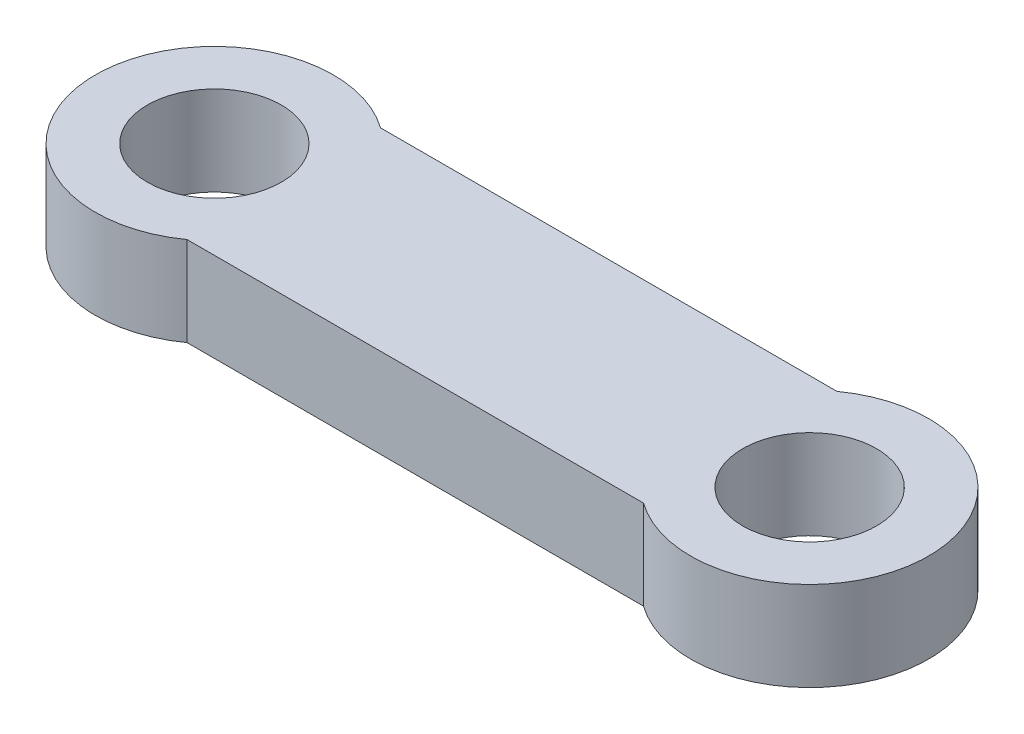
ISO-10303-21;
HEADER;
FILE_DESCRIPTION(('STEP AP214'),'2;1');
FILE_NAME('part.step','',(''),(''),'','','');
FILE_SCHEMA(('AUTOMOTIVE_DESIGN { 1 0 10303 214 1 1 1 1 }'));
ENDSEC;
DATA;
#1=APPLICATION_CONTEXT('core data for automotive mechanical design processes');
#2=APPLICATION_PROTOCOL_DEFINITION('international standard','automotive_design',2000,#1);
#3=PRODUCT_CONTEXT('',#1,'mechanical');
#4=PRODUCT('Part','Part','',(#3));
#5=PRODUCT_RELATED_PRODUCT_CATEGORY('part','',(#4));
#6=PRODUCT_DEFINITION_FORMATION('','',#4);
#7=PRODUCT_DEFINITION_CONTEXT('part definition',#1,'design');
#8=PRODUCT_DEFINITION('design','',#6,#7);
#9=PRODUCT_DEFINITION_SHAPE('','',#8);
#10=(LENGTH_UNIT() NAMED_UNIT(*) SI_UNIT(.MILLI.,.METRE.));
#11=(NAMED_UNIT(*) PLANE_ANGLE_UNIT() SI_UNIT($,.RADIAN.));
#12=(NAMED_UNIT(*) SI_UNIT($,.STERADIAN.) SOLID_ANGLE_UNIT());
#13=UNCERTAINTY_MEASURE_WITH_UNIT(LENGTH_MEASURE(1.E-05),#10,'distance_accuracy_value','');
#14=(GEOMETRIC_REPRESENTATION_CONTEXT(3) GLOBAL_UNCERTAINTY_ASSIGNED_CONTEXT((#13)) GLOBAL_UNIT_ASSIGNED_CONTEXT((#10,
#11,#12)) REPRESENTATION_CONTEXT('',''));
#15=CARTESIAN_POINT('',(0.,0.,0.));
#16=DIRECTION('',(0.,0.,1.));
#17=DIRECTION('',(1.,0.,0.));
#18=AXIS2_PLACEMENT_3D('',#15,#16,#17);
#19=CARTESIAN_POINT('',(-20.,6.,0.));
#20=DIRECTION('',(0.,-1.,0.));
#21=DIRECTION('',(0.,0.,-1.));
#22=AXIS2_PLACEMENT_3D('',#19,#20,#21);
#23=PLANE('',#22);
#24=CARTESIAN_POINT('',(-20.,6.,0.));
#25=DIRECTION('',(0.,1.,0.));
#26=DIRECTION('',(0.,0.,-1.));
#27=AXIS2_PLACEMENT_3D('',#24,#25,#26);
#28=CIRCLE('',#27,8.00000000000001);
#29=CARTESIAN_POINT('',(-15.3363104734556,6.,-6.5));
#30=VERTEX_POINT('',#29);
#31=CARTESIAN_POINT('',(-15.3363104734556,6.,6.5));
#32=VERTEX_POINT('',#31);
#33=EDGE_CURVE('E93',#30,#32,#28,.T.);
#34=ORIENTED_EDGE('',*,*,#33,.T.);
#35=DIRECTION('',(1.,0.,0.));
#36=VECTOR('',#35,1.);
#37=CARTESIAN_POINT('',(15.3363104734556,6.,6.5));
#38=LINE('',#37,#36);
#39=CARTESIAN_POINT('',(15.3363104734556,6.,6.5));
#40=VERTEX_POINT('',#39);
#41=EDGE_CURVE('E88',#32,#40,#38,.T.);
#42=ORIENTED_EDGE('',*,*,#41,.T.);
#43=CARTESIAN_POINT('',(20.,6.,0.));
#44=DIRECTION('',(0.,1.,0.));
#45=DIRECTION('',(0.,0.,1.));
#46=AXIS2_PLACEMENT_3D('',#43,#44,#45);
#47=CIRCLE('',#46,7.99999999999999);
#48=CARTESIAN_POINT('',(15.3363104734556,6.,-6.5));
#49=VERTEX_POINT('',#48);
#50=EDGE_CURVE('E91',#40,#49,#47,.T.);
#51=ORIENTED_EDGE('',*,*,#50,.T.);
#52=DIRECTION('',(-1.,0.,0.));
#53=VECTOR('',#52,1.);
#54=CARTESIAN_POINT('',(-15.3363104734556,6.,-6.5));
#55=LINE('',#54,#53);
#56=EDGE_CURVE('E58',#49,#30,#55,.T.);
#57=ORIENTED_EDGE('',*,*,#56,.T.);
#58=EDGE_LOOP('',(#34,#42,#51,#57));
#59=FACE_BOUND('',#58,.T.);
#60=CARTESIAN_POINT('',(-20.,6.,0.));
#61=DIRECTION('',(0.,1.,0.));
#62=DIRECTION('',(0.,0.,1.));
#63=AXIS2_PLACEMENT_3D('',#60,#61,#62);
#64=CIRCLE('',#63,4.5);
#65=CARTESIAN_POINT('',(-20.,6.,4.5));
#66=VERTEX_POINT('',#65);
#67=EDGE_CURVE('E108',#66,#66,#64,.T.);
#68=ORIENTED_EDGE('',*,*,#67,.F.);
#69=EDGE_LOOP('',(#68));
#70=FACE_BOUND('',#69,.T.);
#71=CARTESIAN_POINT('',(20.,6.,0.));
#72=DIRECTION('',(0.,1.,0.));
#73=DIRECTION('',(0.,0.,1.));
#74=AXIS2_PLACEMENT_3D('',#71,#72,#73);
#75=CIRCLE('',#74,4.5);
#76=CARTESIAN_POINT('',(20.,6.,4.5));
#77=VERTEX_POINT('',#76);
#78=EDGE_CURVE('E123',#77,#77,#75,.T.);
#79=ORIENTED_EDGE('',*,*,#78,.F.);
#80=EDGE_LOOP('',(#79));
#81=FACE_BOUND('',#80,.T.);
#82=ADVANCED_FACE('F41',(#59,#70,#81),#23,.F.);
#83=CARTESIAN_POINT('',(-20.,0.,0.));
#84=DIRECTION('',(0.,-1.,0.));
#85=DIRECTION('',(0.,0.,-1.));
#86=AXIS2_PLACEMENT_3D('',#83,#84,#85);
#87=PLANE('',#86);
#88=CARTESIAN_POINT('',(-20.,0.,0.));
#89=DIRECTION('',(0.,1.,0.));
#90=DIRECTION('',(0.,0.,1.));
#91=AXIS2_PLACEMENT_3D('',#88,#89,#90);
#92=CIRCLE('',#91,4.5);
#93=CARTESIAN_POINT('',(-20.,0.,4.5));
#94=VERTEX_POINT('',#93);
#95=EDGE_CURVE('E120',#94,#94,#92,.T.);
#96=ORIENTED_EDGE('',*,*,#95,.T.);
#97=EDGE_LOOP('',(#96));
#98=FACE_BOUND('',#97,.T.);
#99=CARTESIAN_POINT('',(-20.,0.,0.));
#100=DIRECTION('',(0.,1.,0.));
#101=DIRECTION('',(0.,0.,-1.));
#102=AXIS2_PLACEMENT_3D('',#99,#100,#101);
#103=CIRCLE('',#102,8.00000000000001);
#104=CARTESIAN_POINT('',(-15.3363104734556,0.,-6.5));
#105=VERTEX_POINT('',#104);
#106=CARTESIAN_POINT('',(-15.3363104734556,0.,6.5));
#107=VERTEX_POINT('',#106);
#108=EDGE_CURVE('E105',#105,#107,#103,.T.);
#109=ORIENTED_EDGE('',*,*,#108,.F.);
#110=DIRECTION('',(-1.,0.,0.));
#111=VECTOR('',#110,1.);
#112=CARTESIAN_POINT('',(-15.3363104734556,0.,-6.5));
#113=LINE('',#112,#111);
#114=CARTESIAN_POINT('',(15.3363104734556,0.,-6.5));
#115=VERTEX_POINT('',#114);
#116=EDGE_CURVE('E81',#115,#105,#113,.T.);
#117=ORIENTED_EDGE('',*,*,#116,.F.);
#118=CARTESIAN_POINT('',(20.,0.,0.));
#119=DIRECTION('',(0.,1.,0.));
#120=DIRECTION('',(0.,0.,1.));
#121=AXIS2_PLACEMENT_3D('',#118,#119,#120);
#122=CIRCLE('',#121,7.99999999999999);
#123=CARTESIAN_POINT('',(15.3363104734556,0.,6.5));
#124=VERTEX_POINT('',#123);
#125=EDGE_CURVE('E75',#124,#115,#122,.T.);
#126=ORIENTED_EDGE('',*,*,#125,.F.);
#127=DIRECTION('',(1.,0.,0.));
#128=VECTOR('',#127,1.);
#129=CARTESIAN_POINT('',(15.3363104734556,0.,6.5));
#130=LINE('',#129,#128);
#131=EDGE_CURVE('E97',#107,#124,#130,.T.);
#132=ORIENTED_EDGE('',*,*,#131,.F.);
#133=EDGE_LOOP('',(#109,#117,#126,#132));
#134=FACE_BOUND('',#133,.T.);
#135=CARTESIAN_POINT('',(20.,0.,0.));
#136=DIRECTION('',(0.,1.,0.));
#137=DIRECTION('',(0.,0.,1.));
#138=AXIS2_PLACEMENT_3D('',#135,#136,#137);
#139=CIRCLE('',#138,4.5);
#140=CARTESIAN_POINT('',(20.,0.,4.5));
#141=VERTEX_POINT('',#140);
#142=EDGE_CURVE('E126',#141,#141,#139,.T.);
#143=ORIENTED_EDGE('',*,*,#142,.T.);
#144=EDGE_LOOP('',(#143));
#145=FACE_BOUND('',#144,.T.);
#146=ADVANCED_FACE('F116',(#98,#134,#145),#87,.T.);
#147=CARTESIAN_POINT('',(-20.,6.,0.));
#148=DIRECTION('',(0.,-1.,0.));
#149=DIRECTION('',(0.,0.,-1.));
#150=AXIS2_PLACEMENT_3D('',#147,#148,#149);
#151=CYLINDRICAL_SURFACE('',#150,8.00000000000001);
#152=ORIENTED_EDGE('',*,*,#108,.T.);
#153=DIRECTION('',(0.,-1.,0.));
#154=VECTOR('',#153,1.);
#155=CARTESIAN_POINT('',(-15.3363104734556,6.,6.5));
#156=LINE('',#155,#154);
#157=EDGE_CURVE('E11',#32,#107,#156,.T.);
#158=ORIENTED_EDGE('',*,*,#157,.F.);
#159=ORIENTED_EDGE('',*,*,#33,.F.);
#160=DIRECTION('',(0.,-1.,0.));
#161=VECTOR('',#160,1.);
#162=CARTESIAN_POINT('',(-15.3363104734556,6.,-6.5));
#163=LINE('',#162,#161);
#164=EDGE_CURVE('E101',#30,#105,#163,.T.);
#165=ORIENTED_EDGE('',*,*,#164,.T.);
#166=EDGE_LOOP('',(#152,#158,#159,#165));
#167=FACE_BOUND('',#166,.T.);
#168=ADVANCED_FACE('F43',(#167),#151,.T.);
#169=CARTESIAN_POINT('',(15.3363104734556,6.,6.5));
#170=DIRECTION('',(0.,0.,-1.));
#171=DIRECTION('',(-1.,0.,0.));
#172=AXIS2_PLACEMENT_3D('',#169,#170,#171);
#173=PLANE('',#172);
#174=ORIENTED_EDGE('',*,*,#131,.T.);
#175=DIRECTION('',(0.,-1.,0.));
#176=VECTOR('',#175,1.);
#177=CARTESIAN_POINT('',(15.3363104734556,6.,6.5));
#178=LINE('',#177,#176);
#179=EDGE_CURVE('E50',#40,#124,#178,.T.);
#180=ORIENTED_EDGE('',*,*,#179,.F.);
#181=ORIENTED_EDGE('',*,*,#41,.F.);
#182=ORIENTED_EDGE('',*,*,#157,.T.);
#183=EDGE_LOOP('',(#174,#180,#181,#182));
#184=FACE_BOUND('',#183,.T.);
#185=ADVANCED_FACE('F96',(#184),#173,.F.);
#186=CARTESIAN_POINT('',(20.,6.,0.));
#187=DIRECTION('',(0.,-1.,0.));
#188=DIRECTION('',(0.,0.,-1.));
#189=AXIS2_PLACEMENT_3D('',#186,#187,#188);
#190=CYLINDRICAL_SURFACE('',#189,7.99999999999999);
#191=ORIENTED_EDGE('',*,*,#125,.T.);
#192=DIRECTION('',(0.,-1.,0.));
#193=VECTOR('',#192,1.);
#194=CARTESIAN_POINT('',(15.3363104734556,6.,-6.5));
#195=LINE('',#194,#193);
#196=EDGE_CURVE('E98',#49,#115,#195,.T.);
#197=ORIENTED_EDGE('',*,*,#196,.F.);
#198=ORIENTED_EDGE('',*,*,#50,.F.);
#199=ORIENTED_EDGE('',*,*,#179,.T.);
#200=EDGE_LOOP('',(#191,#197,#198,#199));
#201=FACE_BOUND('',#200,.T.);
#202=ADVANCED_FACE('F99',(#201),#190,.T.);
#203=CARTESIAN_POINT('',(-15.3363104734556,6.,-6.5));
#204=DIRECTION('',(0.,0.,1.));
#205=DIRECTION('',(1.,0.,0.));
#206=AXIS2_PLACEMENT_3D('',#203,#204,#205);
#207=PLANE('',#206);
#208=ORIENTED_EDGE('',*,*,#116,.T.);
#209=ORIENTED_EDGE('',*,*,#164,.F.);
#210=ORIENTED_EDGE('',*,*,#56,.F.);
#211=ORIENTED_EDGE('',*,*,#196,.T.);
#212=EDGE_LOOP('',(#208,#209,#210,#211));
#213=FACE_BOUND('',#212,.T.);
#214=ADVANCED_FACE('F113',(#213),#207,.F.);
#215=CARTESIAN_POINT('',(-20.,6.,0.));
#216=DIRECTION('',(0.,-1.,0.));
#217=DIRECTION('',(0.,0.,-1.));
#218=AXIS2_PLACEMENT_3D('',#215,#216,#217);
#219=CYLINDRICAL_SURFACE('',#218,4.5);
#220=ORIENTED_EDGE('',*,*,#67,.T.);
#221=EDGE_LOOP('',(#220));
#222=FACE_BOUND('',#221,.T.);
#223=ORIENTED_EDGE('',*,*,#95,.F.);
#224=EDGE_LOOP('',(#223));
#225=FACE_BOUND('',#224,.T.);
#226=ADVANCED_FACE('F143',(#222,#225),#219,.F.);
#227=CARTESIAN_POINT('',(20.,6.,0.));
#228=DIRECTION('',(0.,-1.,0.));
#229=DIRECTION('',(0.,0.,-1.));
#230=AXIS2_PLACEMENT_3D('',#227,#228,#229);
#231=CYLINDRICAL_SURFACE('',#230,4.5);
#232=ORIENTED_EDGE('',*,*,#78,.T.);
#233=EDGE_LOOP('',(#232));
#234=FACE_BOUND('',#233,.T.);
#235=ORIENTED_EDGE('',*,*,#142,.F.);
#236=EDGE_LOOP('',(#235));
#237=FACE_BOUND('',#236,.T.);
#238=ADVANCED_FACE('F132',(#234,#237),#231,.F.);
#239=CLOSED_SHELL('',(#82,#146,#168,#185,#202,#214,#226,#238));
#240=MANIFOLD_SOLID_BREP('B2',#239);
#241=ADVANCED_BREP_SHAPE_REPRESENTATION('',(#18,#240),#14);
#242=SHAPE_DEFINITION_REPRESENTATION(#9,#241);
ENDSEC;
END-ISO-10303-21;
